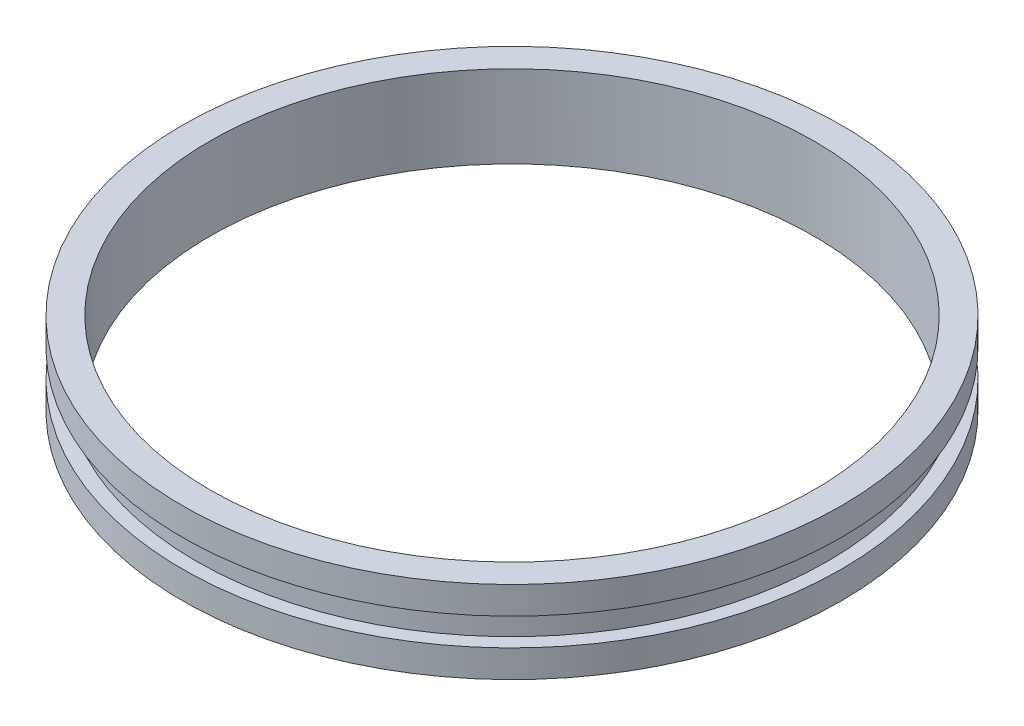
ISO-10303-21;
HEADER;
FILE_DESCRIPTION(('STEP AP214'),'2;1');
FILE_NAME('part.step','',(''),(''),'','','');
FILE_SCHEMA(('AUTOMOTIVE_DESIGN { 1 0 10303 214 1 1 1 1 }'));
ENDSEC;
DATA;
#1=APPLICATION_CONTEXT('core data for automotive mechanical design processes');
#2=APPLICATION_PROTOCOL_DEFINITION('international standard','automotive_design',2000,#1);
#3=PRODUCT_CONTEXT('',#1,'mechanical');
#4=PRODUCT('Part','Part','',(#3));
#5=PRODUCT_RELATED_PRODUCT_CATEGORY('part','',(#4));
#6=PRODUCT_DEFINITION_FORMATION('','',#4);
#7=PRODUCT_DEFINITION_CONTEXT('part definition',#1,'design');
#8=PRODUCT_DEFINITION('design','',#6,#7);
#9=PRODUCT_DEFINITION_SHAPE('','',#8);
#10=(LENGTH_UNIT() NAMED_UNIT(*) SI_UNIT(.MILLI.,.METRE.));
#11=(NAMED_UNIT(*) PLANE_ANGLE_UNIT() SI_UNIT($,.RADIAN.));
#12=(NAMED_UNIT(*) SI_UNIT($,.STERADIAN.) SOLID_ANGLE_UNIT());
#13=UNCERTAINTY_MEASURE_WITH_UNIT(LENGTH_MEASURE(1.E-05),#10,'distance_accuracy_value','');
#14=(GEOMETRIC_REPRESENTATION_CONTEXT(3) GLOBAL_UNCERTAINTY_ASSIGNED_CONTEXT((#13)) GLOBAL_UNIT_ASSIGNED_CONTEXT((#10,
#11,#12)) REPRESENTATION_CONTEXT('',''));
#15=CARTESIAN_POINT('',(0.,0.,0.));
#16=DIRECTION('',(0.,0.,1.));
#17=DIRECTION('',(1.,0.,0.));
#18=AXIS2_PLACEMENT_3D('',#15,#16,#17);
#19=CARTESIAN_POINT('',(0.,0.,0.));
#20=DIRECTION('',(0.,1.,0.));
#21=DIRECTION('',(-1.,0.,0.));
#22=AXIS2_PLACEMENT_3D('',#19,#20,#21);
#23=PLANE('',#22);
#24=CARTESIAN_POINT('',(0.,0.,0.));
#25=DIRECTION('',(0.,1.,0.));
#26=DIRECTION('',(0.,0.,1.));
#27=AXIS2_PLACEMENT_3D('',#24,#25,#26);
#28=CIRCLE('',#27,5.5);
#29=CARTESIAN_POINT('',(0.,0.,5.5));
#30=VERTEX_POINT('',#29);
#31=EDGE_CURVE('E70',#30,#30,#28,.T.);
#32=ORIENTED_EDGE('',*,*,#31,.F.);
#33=EDGE_LOOP('',(#32));
#34=FACE_BOUND('',#33,.T.);
#35=CARTESIAN_POINT('',(0.,0.,0.));
#36=DIRECTION('',(0.,-1.,0.));
#37=DIRECTION('',(1.,0.,0.));
#38=AXIS2_PLACEMENT_3D('',#35,#36,#37);
#39=CIRCLE('',#38,6.);
#40=CARTESIAN_POINT('',(6.,0.,0.));
#41=VERTEX_POINT('',#40);
#42=EDGE_CURVE('E10',#41,#41,#39,.T.);
#43=ORIENTED_EDGE('',*,*,#42,.F.);
#44=EDGE_LOOP('',(#43));
#45=FACE_BOUND('',#44,.T.);
#46=ADVANCED_FACE('F39',(#34,#45),#23,.T.);
#47=CARTESIAN_POINT('',(0.,-1.5,0.));
#48=DIRECTION('',(0.,-1.,0.));
#49=DIRECTION('',(1.,0.,0.));
#50=AXIS2_PLACEMENT_3D('',#47,#48,#49);
#51=CYLINDRICAL_SURFACE('',#50,6.);
#52=ORIENTED_EDGE('',*,*,#42,.T.);
#53=EDGE_LOOP('',(#52));
#54=FACE_BOUND('',#53,.T.);
#55=CARTESIAN_POINT('',(0.,-0.5,0.));
#56=DIRECTION('',(0.,-1.,0.));
#57=DIRECTION('',(1.,0.,0.));
#58=AXIS2_PLACEMENT_3D('',#55,#56,#57);
#59=CIRCLE('',#58,6.);
#60=CARTESIAN_POINT('',(6.,-0.5,0.));
#61=VERTEX_POINT('',#60);
#62=EDGE_CURVE('E47',#61,#61,#59,.T.);
#63=ORIENTED_EDGE('',*,*,#62,.F.);
#64=EDGE_LOOP('',(#63));
#65=FACE_BOUND('',#64,.T.);
#66=ADVANCED_FACE('F99',(#54,#65),#51,.T.);
#67=CARTESIAN_POINT('',(6.,-0.5,0.));
#68=DIRECTION('',(0.,-1.,0.));
#69=DIRECTION('',(1.,0.,0.));
#70=AXIS2_PLACEMENT_3D('',#67,#68,#69);
#71=PLANE('',#70);
#72=ORIENTED_EDGE('',*,*,#62,.T.);
#73=EDGE_LOOP('',(#72));
#74=FACE_BOUND('',#73,.T.);
#75=CARTESIAN_POINT('',(0.,-0.5,0.));
#76=DIRECTION('',(0.,-1.,0.));
#77=DIRECTION('',(1.,0.,0.));
#78=AXIS2_PLACEMENT_3D('',#75,#76,#77);
#79=CIRCLE('',#78,5.75);
#80=CARTESIAN_POINT('',(5.75,-0.5,0.));
#81=VERTEX_POINT('',#80);
#82=EDGE_CURVE('E52',#81,#81,#79,.T.);
#83=ORIENTED_EDGE('',*,*,#82,.F.);
#84=EDGE_LOOP('',(#83));
#85=FACE_BOUND('',#84,.T.);
#86=ADVANCED_FACE('F104',(#74,#85),#71,.T.);
#87=CARTESIAN_POINT('',(0.,-1.5,0.));
#88=DIRECTION('',(0.,-1.,0.));
#89=DIRECTION('',(1.,0.,0.));
#90=AXIS2_PLACEMENT_3D('',#87,#88,#89);
#91=CYLINDRICAL_SURFACE('',#90,5.75);
#92=ORIENTED_EDGE('',*,*,#82,.T.);
#93=EDGE_LOOP('',(#92));
#94=FACE_BOUND('',#93,.T.);
#95=CARTESIAN_POINT('',(0.,-1.,0.));
#96=DIRECTION('',(0.,-1.,0.));
#97=DIRECTION('',(1.,0.,0.));
#98=AXIS2_PLACEMENT_3D('',#95,#96,#97);
#99=CIRCLE('',#98,5.75);
#100=CARTESIAN_POINT('',(5.75,-1.,0.));
#101=VERTEX_POINT('',#100);
#102=EDGE_CURVE('E58',#101,#101,#99,.T.);
#103=ORIENTED_EDGE('',*,*,#102,.F.);
#104=EDGE_LOOP('',(#103));
#105=FACE_BOUND('',#104,.T.);
#106=ADVANCED_FACE('F95',(#94,#105),#91,.T.);
#107=CARTESIAN_POINT('',(5.75,-1.,0.));
#108=DIRECTION('',(0.,1.,0.));
#109=DIRECTION('',(-1.,0.,0.));
#110=AXIS2_PLACEMENT_3D('',#107,#108,#109);
#111=PLANE('',#110);
#112=ORIENTED_EDGE('',*,*,#102,.T.);
#113=EDGE_LOOP('',(#112));
#114=FACE_BOUND('',#113,.T.);
#115=CARTESIAN_POINT('',(0.,-1.,0.));
#116=DIRECTION('',(0.,-1.,0.));
#117=DIRECTION('',(1.,0.,0.));
#118=AXIS2_PLACEMENT_3D('',#115,#116,#117);
#119=CIRCLE('',#118,6.);
#120=CARTESIAN_POINT('',(6.,-1.,0.));
#121=VERTEX_POINT('',#120);
#122=EDGE_CURVE('E62',#121,#121,#119,.T.);
#123=ORIENTED_EDGE('',*,*,#122,.F.);
#124=EDGE_LOOP('',(#123));
#125=FACE_BOUND('',#124,.T.);
#126=ADVANCED_FACE('F89',(#114,#125),#111,.T.);
#127=CARTESIAN_POINT('',(0.,-1.5,0.));
#128=DIRECTION('',(0.,-1.,0.));
#129=DIRECTION('',(1.,0.,0.));
#130=AXIS2_PLACEMENT_3D('',#127,#128,#129);
#131=CYLINDRICAL_SURFACE('',#130,6.);
#132=ORIENTED_EDGE('',*,*,#122,.T.);
#133=EDGE_LOOP('',(#132));
#134=FACE_BOUND('',#133,.T.);
#135=CARTESIAN_POINT('',(0.,-1.5,0.));
#136=DIRECTION('',(0.,-1.,0.));
#137=DIRECTION('',(1.,0.,0.));
#138=AXIS2_PLACEMENT_3D('',#135,#136,#137);
#139=CIRCLE('',#138,6.);
#140=CARTESIAN_POINT('',(6.,-1.5,0.));
#141=VERTEX_POINT('',#140);
#142=EDGE_CURVE('E66',#141,#141,#139,.T.);
#143=ORIENTED_EDGE('',*,*,#142,.F.);
#144=EDGE_LOOP('',(#143));
#145=FACE_BOUND('',#144,.T.);
#146=ADVANCED_FACE('F84',(#134,#145),#131,.T.);
#147=CARTESIAN_POINT('',(6.,-1.5,0.));
#148=DIRECTION('',(0.,-1.,0.));
#149=DIRECTION('',(1.,0.,0.));
#150=AXIS2_PLACEMENT_3D('',#147,#148,#149);
#151=PLANE('',#150);
#152=CARTESIAN_POINT('',(0.,-1.5,0.));
#153=DIRECTION('',(0.,-1.,0.));
#154=DIRECTION('',(1.,0.,0.));
#155=AXIS2_PLACEMENT_3D('',#152,#153,#154);
#156=CIRCLE('',#155,5.5);
#157=CARTESIAN_POINT('',(5.5,-1.5,0.));
#158=VERTEX_POINT('',#157);
#159=EDGE_CURVE('E42',#158,#158,#156,.T.);
#160=ORIENTED_EDGE('',*,*,#159,.F.);
#161=EDGE_LOOP('',(#160));
#162=FACE_BOUND('',#161,.T.);
#163=ORIENTED_EDGE('',*,*,#142,.T.);
#164=EDGE_LOOP('',(#163));
#165=FACE_BOUND('',#164,.T.);
#166=ADVANCED_FACE('F81',(#162,#165),#151,.T.);
#167=CARTESIAN_POINT('',(0.,-10.,0.));
#168=DIRECTION('',(0.,1.,0.));
#169=DIRECTION('',(0.,0.,1.));
#170=AXIS2_PLACEMENT_3D('',#167,#168,#169);
#171=CYLINDRICAL_SURFACE('',#170,5.5);
#172=ORIENTED_EDGE('',*,*,#159,.T.);
#173=EDGE_LOOP('',(#172));
#174=FACE_BOUND('',#173,.T.);
#175=ORIENTED_EDGE('',*,*,#31,.T.);
#176=EDGE_LOOP('',(#175));
#177=FACE_BOUND('',#176,.T.);
#178=ADVANCED_FACE('F79',(#174,#177),#171,.F.);
#179=CLOSED_SHELL('',(#46,#66,#86,#106,#126,#146,#166,#178));
#180=MANIFOLD_SOLID_BREP('B2',#179);
#181=ADVANCED_BREP_SHAPE_REPRESENTATION('',(#18,#180),#14);
#182=SHAPE_DEFINITION_REPRESENTATION(#9,#181);
ENDSEC;
END-ISO-10303-21;
